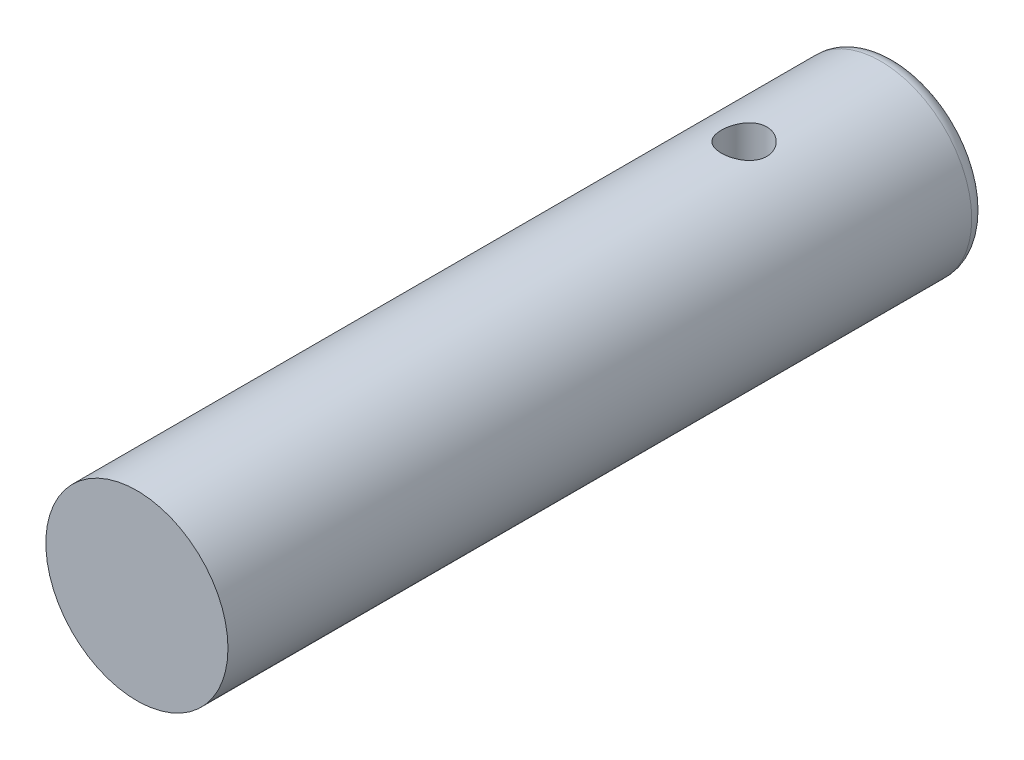
ISO-10303-21;
HEADER;
FILE_DESCRIPTION(('STEP AP214'),'2;1');
FILE_NAME('part.step','',(''),(''),'','','');
FILE_SCHEMA(('AUTOMOTIVE_DESIGN { 1 0 10303 214 1 1 1 1 }'));
ENDSEC;
DATA;
#1=APPLICATION_CONTEXT('core data for automotive mechanical design processes');
#2=APPLICATION_PROTOCOL_DEFINITION('international standard','automotive_design',2000,#1);
#3=PRODUCT_CONTEXT('',#1,'mechanical');
#4=PRODUCT('Part','Part','',(#3));
#5=PRODUCT_RELATED_PRODUCT_CATEGORY('part','',(#4));
#6=PRODUCT_DEFINITION_FORMATION('','',#4);
#7=PRODUCT_DEFINITION_CONTEXT('part definition',#1,'design');
#8=PRODUCT_DEFINITION('design','',#6,#7);
#9=PRODUCT_DEFINITION_SHAPE('','',#8);
#10=(LENGTH_UNIT() NAMED_UNIT(*) SI_UNIT(.MILLI.,.METRE.));
#11=(NAMED_UNIT(*) PLANE_ANGLE_UNIT() SI_UNIT($,.RADIAN.));
#12=(NAMED_UNIT(*) SI_UNIT($,.STERADIAN.) SOLID_ANGLE_UNIT());
#13=UNCERTAINTY_MEASURE_WITH_UNIT(LENGTH_MEASURE(1.E-05),#10,'distance_accuracy_value','');
#14=(GEOMETRIC_REPRESENTATION_CONTEXT(3) GLOBAL_UNCERTAINTY_ASSIGNED_CONTEXT((#13)) GLOBAL_UNIT_ASSIGNED_CONTEXT((#10,
#11,#12)) REPRESENTATION_CONTEXT('',''));
#15=CARTESIAN_POINT('',(0.,0.,0.));
#16=DIRECTION('',(0.,0.,1.));
#17=DIRECTION('',(1.,0.,0.));
#18=AXIS2_PLACEMENT_3D('',#15,#16,#17);
#19=CARTESIAN_POINT('',(0.,0.,25.));
#20=DIRECTION('',(0.,0.,-1.));
#21=DIRECTION('',(-1.,0.,0.));
#22=AXIS2_PLACEMENT_3D('',#19,#20,#21);
#23=CYLINDRICAL_SURFACE('',#22,3.);
#24=CARTESIAN_POINT('',(0.,0.,0.5));
#25=DIRECTION('',(0.,0.,1.));
#26=DIRECTION('',(1.,0.,0.));
#27=AXIS2_PLACEMENT_3D('',#24,#25,#26);
#28=CIRCLE('',#27,3.);
#29=CARTESIAN_POINT('',(3.,0.,0.5));
#30=VERTEX_POINT('',#29);
#31=EDGE_CURVE('E43',#30,#30,#28,.T.);
#32=ORIENTED_EDGE('',*,*,#31,.T.);
#33=EDGE_LOOP('',(#32));
#34=FACE_BOUND('',#33,.T.);
#35=CARTESIAN_POINT('',(0.,-3.,5.75));
#36=CARTESIAN_POINT('',(0.0414380443348666,-2.99999929934006,5.74999883713092));
#37=CARTESIAN_POINT('',(0.0828890789153827,-2.99913289065914,5.74655422461311));
#38=CARTESIAN_POINT('',(0.164603161885267,-2.99576056914946,5.7328874243465));
#39=CARTESIAN_POINT('',(0.204865523435371,-2.99325372709984,5.72266139523108));
#40=CARTESIAN_POINT('',(0.283010436091289,-2.9868781316602,5.69578037326896));
#41=CARTESIAN_POINT('',(0.320895781715002,-2.98301101421043,5.67913310064236));
#42=CARTESIAN_POINT('',(0.393336065952214,-2.97432671903796,5.63990930497758));
#43=CARTESIAN_POINT('',(0.427890892174381,-2.96950950927025,5.61733258194053));
#44=CARTESIAN_POINT('',(0.493400963650461,-2.95933706795901,5.56639960517289));
#45=CARTESIAN_POINT('',(0.524277845030537,-2.95397353574266,5.53794421252041));
#46=CARTESIAN_POINT('',(0.580874463601654,-2.94336810058765,5.47627389754554));
#47=CARTESIAN_POINT('',(0.606593618474568,-2.93812621144174,5.44305843852675));
#48=CARTESIAN_POINT('',(0.652513271399517,-2.92827387849855,5.37220238663128));
#49=CARTESIAN_POINT('',(0.67262610796268,-2.92367397235302,5.3345033845948));
#50=CARTESIAN_POINT('',(0.706198454275265,-2.91574747406112,5.25612579417082));
#51=CARTESIAN_POINT('',(0.719659027719668,-2.91242067836394,5.21544768333712));
#52=CARTESIAN_POINT('',(0.739277418402146,-2.90750238358775,5.13312825089876));
#53=CARTESIAN_POINT('',(0.74557613416667,-2.90587745537713,5.0915225519751));
#54=CARTESIAN_POINT('',(0.751130887533927,-2.9044468126887,5.00781571549301));
#55=CARTESIAN_POINT('',(0.75038807090899,-2.90464080224322,4.9657146596507));
#56=CARTESIAN_POINT('',(0.741993262319641,-2.90679602748309,4.88329209612776));
#57=CARTESIAN_POINT('',(0.734509170095261,-2.9087143150094,4.84295218926745));
#58=CARTESIAN_POINT('',(0.713112093451554,-2.91403354838242,4.76411947454435));
#59=CARTESIAN_POINT('',(0.699198651034713,-2.91743459985348,4.72562679848551));
#60=CARTESIAN_POINT('',(0.665194738968578,-2.92537556952093,4.65113099187397));
#61=CARTESIAN_POINT('',(0.645043333616456,-2.92992663734711,4.61515691410522));
#62=CARTESIAN_POINT('',(0.599178138007478,-2.93964855423193,4.54704064512158));
#63=CARTESIAN_POINT('',(0.57346337440442,-2.94481951167368,4.51489912596637));
#64=CARTESIAN_POINT('',(0.51633171234061,-2.95537940269891,4.4543981921528));
#65=CARTESIAN_POINT('',(0.484773129082931,-2.96077034738986,4.42617275496933));
#66=CARTESIAN_POINT('',(0.417305958751851,-2.97102982789393,4.37538937876805));
#67=CARTESIAN_POINT('',(0.381397238853972,-2.97589834774708,4.35283161286822));
#68=CARTESIAN_POINT('',(0.306057944340697,-2.98458866047091,4.31397470688781));
#69=CARTESIAN_POINT('',(0.266615696604312,-2.98840680063863,4.29769732987279));
#70=CARTESIAN_POINT('',(0.185438004071442,-2.99453958495709,4.27204134714521));
#71=CARTESIAN_POINT('',(0.143702999575243,-2.99685451669641,4.26266142179093));
#72=CARTESIAN_POINT('',(0.0602699851950145,-2.99967749635687,4.25127121722058));
#73=CARTESIAN_POINT('',(0.018598359994106,-3.00023026754139,4.24907848696235));
#74=CARTESIAN_POINT('',(-0.0645164374007528,-2.99959402407225,4.25162450102774));
#75=CARTESIAN_POINT('',(-0.105959629822296,-2.99840516620923,4.25636262139957));
#76=CARTESIAN_POINT('',(-0.186807134388245,-2.99444790563679,4.27248545419569));
#77=CARTESIAN_POINT('',(-0.226232559484376,-2.99170317092906,4.28377063173849));
#78=CARTESIAN_POINT('',(-0.302628646226255,-2.98494353317067,4.31255354201422));
#79=CARTESIAN_POINT('',(-0.339599059516316,-2.98092850184946,4.33005190215659));
#80=CARTESIAN_POINT('',(-0.410761567214923,-2.97196653963155,4.37111806443736));
#81=CARTESIAN_POINT('',(-0.444892720917914,-2.96700433683466,4.39478805619838));
#82=CARTESIAN_POINT('',(-0.508763306821622,-2.9567225459371,4.44739495439849));
#83=CARTESIAN_POINT('',(-0.538501979486503,-2.95140289625852,4.47633276980845));
#84=CARTESIAN_POINT('',(-0.593495284036364,-2.94084478480386,4.53950098042223));
#85=CARTESIAN_POINT('',(-0.618621933811015,-2.93561152093641,4.57384385150121));
#86=CARTESIAN_POINT('',(-0.662755379506347,-2.92596439188619,4.64636631723286));
#87=CARTESIAN_POINT('',(-0.681762447078967,-2.92155049033513,4.68454574147988));
#88=CARTESIAN_POINT('',(-0.712975710304645,-2.91409047367333,4.76345286120654));
#89=CARTESIAN_POINT('',(-0.725222198327031,-2.91103627645953,4.80416381417201));
#90=CARTESIAN_POINT('',(-0.742672829976888,-2.90663372045092,4.88715481894455));
#91=CARTESIAN_POINT('',(-0.747878513739328,-2.90528498859968,4.92943452551625));
#92=CARTESIAN_POINT('',(-0.751019295166996,-2.90447450601978,5.0130605119276));
#93=CARTESIAN_POINT('',(-0.749158948890058,-2.90495966364132,5.05439871756237));
#94=CARTESIAN_POINT('',(-0.738688639156432,-2.90763954503921,5.13615194433399));
#95=CARTESIAN_POINT('',(-0.730078811343383,-2.90983423445928,5.17656698400683));
#96=CARTESIAN_POINT('',(-0.706465659721396,-2.91565630341361,5.2551042295327));
#97=CARTESIAN_POINT('',(-0.691500702340187,-2.91927507618155,5.2932386526201));
#98=CARTESIAN_POINT('',(-0.655632456802534,-2.92753877862414,5.36648269135685));
#99=CARTESIAN_POINT('',(-0.634728345017094,-2.93218385060387,5.40159188659346));
#100=CARTESIAN_POINT('',(-0.586933874318567,-2.94212817131756,5.46877731450101));
#101=CARTESIAN_POINT('',(-0.559901581456126,-2.94744132415879,5.50075053671198));
#102=CARTESIAN_POINT('',(-0.500894685594866,-2.95804013623143,5.5597735223977));
#103=CARTESIAN_POINT('',(-0.468918910630571,-2.9633257886353,5.58682211505649));
#104=CARTESIAN_POINT('',(-0.400233793351294,-2.97338827823832,5.6357056542823));
#105=CARTESIAN_POINT('',(-0.363449211158192,-2.97815416682934,5.65743730683579));
#106=CARTESIAN_POINT('',(-0.286633029755237,-2.98652462487559,5.69437373147027));
#107=CARTESIAN_POINT('',(-0.246603781718368,-2.99013002599891,5.70958318032427));
#108=CARTESIAN_POINT('',(-0.172205126621735,-2.99524029782771,5.73078591516483));
#109=CARTESIAN_POINT('',(-0.138190085454033,-2.99701292526345,5.73797562152672));
#110=CARTESIAN_POINT('',(-0.0694530357681405,-2.99939302615974,5.74758297181097));
#111=CARTESIAN_POINT('',(-0.034731080621307,-3.00000058725447,5.75000097465265));
#112=CARTESIAN_POINT('',(0.,-3.,5.75));
#113=B_SPLINE_CURVE_WITH_KNOTS('',3,(#35,#36,#37,#38,#39,#40,#41,#42,#43,#44,#45,#46,#47,#48,
#49,#50,#51,#52,#53,#54,#55,#56,#57,#58,#59,#60,#61,#62,#63,#64,#65,#66,#67,#68,#69,#70,#71,#72,
#73,#74,#75,#76,#77,#78,#79,#80,#81,#82,#83,#84,#85,#86,#87,#88,#89,#90,#91,#92,#93,#94,#95,#96,
#97,#98,#99,#100,#101,#102,#103,#104,#105,#106,#107,#108,#109,#110,#111,#112),.UNSPECIFIED.,.T.,
.F.,(4,2,2,2,2,2,2,2,2,2,2,2,2,2,2,2,2,2,2,2,2,2,2,2,2,2,2,2,2,2,2,2,2,2,2,2,2,2,4),(0.,
0.124186856235945,0.24844411888195,0.372552451143053,0.496664970084664,0.623072177185696,
0.74949364790031,0.877793237729034,1.00607230584684,1.13178147549715,1.25747019056348,
1.38011248503509,1.50276351733019,1.6266526393694,1.75056345418081,1.8780075048451,
2.00545544779124,2.13334114504557,2.26120236844321,2.38579154474638,2.51036950556371,
2.63310137257019,2.75584563661145,2.88076793782676,3.00571181504009,3.13372254602238,
3.26172759374754,3.38896127307018,3.51616711626204,3.63971890199306,3.76326820478017,
3.88608200279723,4.0089128406845,4.13494788204955,4.26101284885209,4.38936092749794,
4.51761681910675,4.62171121471074,4.7257977802152),.UNSPECIFIED.);
#114=CARTESIAN_POINT('',(0.,-3.,5.75));
#115=VERTEX_POINT('',#114);
#116=EDGE_CURVE('E47',#115,#115,#113,.T.);
#117=ORIENTED_EDGE('',*,*,#116,.T.);
#118=EDGE_LOOP('',(#117));
#119=FACE_BOUND('',#118,.T.);
#120=CARTESIAN_POINT('',(0.,3.,5.75));
#121=CARTESIAN_POINT('',(-0.0414380443348656,2.99999929934006,5.74999883713092));
#122=CARTESIAN_POINT('',(-0.0828890789153817,2.99913289065914,5.74655422461311));
#123=CARTESIAN_POINT('',(-0.164603161885267,2.99576056914946,5.7328874243465));
#124=CARTESIAN_POINT('',(-0.20486552343537,2.99325372709984,5.72266139523108));
#125=CARTESIAN_POINT('',(-0.283010436091289,2.9868781316602,5.69578037326896));
#126=CARTESIAN_POINT('',(-0.320895781715002,2.98301101421043,5.67913310064236));
#127=CARTESIAN_POINT('',(-0.393336065952213,2.97432671903797,5.63990930497758));
#128=CARTESIAN_POINT('',(-0.42789089217438,2.96950950927025,5.61733258194053));
#129=CARTESIAN_POINT('',(-0.49340096365046,2.95933706795901,5.56639960517289));
#130=CARTESIAN_POINT('',(-0.524277845030536,2.95397353574267,5.53794421252041));
#131=CARTESIAN_POINT('',(-0.580874463601652,2.94336810058765,5.47627389754554));
#132=CARTESIAN_POINT('',(-0.606593618474567,2.93812621144174,5.44305843852675));
#133=CARTESIAN_POINT('',(-0.652513271399516,2.92827387849855,5.37220238663128));
#134=CARTESIAN_POINT('',(-0.672626107962678,2.92367397235303,5.3345033845948));
#135=CARTESIAN_POINT('',(-0.706198454275263,2.91574747406112,5.25612579417082));
#136=CARTESIAN_POINT('',(-0.719659027719666,2.91242067836394,5.21544768333712));
#137=CARTESIAN_POINT('',(-0.739277418402144,2.90750238358775,5.13312825089876));
#138=CARTESIAN_POINT('',(-0.745576134166668,2.90587745537713,5.0915225519751));
#139=CARTESIAN_POINT('',(-0.751130887533925,2.9044468126887,5.00781571549301));
#140=CARTESIAN_POINT('',(-0.750388070908988,2.90464080224322,4.96571465965069));
#141=CARTESIAN_POINT('',(-0.741993262319639,2.90679602748309,4.88329209612776));
#142=CARTESIAN_POINT('',(-0.734509170095259,2.9087143150094,4.84295218926745));
#143=CARTESIAN_POINT('',(-0.713112093451552,2.91403354838242,4.76411947454435));
#144=CARTESIAN_POINT('',(-0.69919865103471,2.91743459985348,4.72562679848551));
#145=CARTESIAN_POINT('',(-0.665194738968575,2.92537556952093,4.65113099187397));
#146=CARTESIAN_POINT('',(-0.645043333616454,2.92992663734711,4.61515691410522));
#147=CARTESIAN_POINT('',(-0.599178138007475,2.93964855423193,4.54704064512158));
#148=CARTESIAN_POINT('',(-0.573463374404418,2.94481951167368,4.51489912596637));
#149=CARTESIAN_POINT('',(-0.516331712340607,2.95537940269891,4.4543981921528));
#150=CARTESIAN_POINT('',(-0.484773129082928,2.96077034738986,4.42617275496933));
#151=CARTESIAN_POINT('',(-0.417305958751848,2.97102982789393,4.37538937876805));
#152=CARTESIAN_POINT('',(-0.38139723885397,2.97589834774708,4.35283161286822));
#153=CARTESIAN_POINT('',(-0.306057944340694,2.98458866047091,4.31397470688781));
#154=CARTESIAN_POINT('',(-0.26661569660431,2.98840680063863,4.29769732987279));
#155=CARTESIAN_POINT('',(-0.185438004071439,2.99453958495709,4.27204134714521));
#156=CARTESIAN_POINT('',(-0.14370299957524,2.99685451669641,4.26266142179093));
#157=CARTESIAN_POINT('',(-0.0602699851950114,2.99967749635687,4.25127121722058));
#158=CARTESIAN_POINT('',(-0.0185983599941029,3.00023026754139,4.24907848696235));
#159=CARTESIAN_POINT('',(0.064516437400756,2.99959402407225,4.25162450102774));
#160=CARTESIAN_POINT('',(0.105959629822299,2.99840516620923,4.25636262139957));
#161=CARTESIAN_POINT('',(0.186807134388248,2.99444790563679,4.27248545419569));
#162=CARTESIAN_POINT('',(0.226232559484379,2.99170317092906,4.28377063173849));
#163=CARTESIAN_POINT('',(0.302628646226258,2.98494353317067,4.31255354201422));
#164=CARTESIAN_POINT('',(0.339599059516319,2.98092850184946,4.33005190215659));
#165=CARTESIAN_POINT('',(0.410761567214926,2.97196653963155,4.37111806443737));
#166=CARTESIAN_POINT('',(0.444892720917917,2.96700433683466,4.39478805619838));
#167=CARTESIAN_POINT('',(0.508763306821625,2.9567225459371,4.44739495439849));
#168=CARTESIAN_POINT('',(0.538501979486506,2.95140289625852,4.47633276980846));
#169=CARTESIAN_POINT('',(0.593495284036367,2.94084478480386,4.53950098042223));
#170=CARTESIAN_POINT('',(0.618621933811017,2.93561152093641,4.57384385150121));
#171=CARTESIAN_POINT('',(0.66275537950635,2.92596439188619,4.64636631723286));
#172=CARTESIAN_POINT('',(0.68176244707897,2.92155049033513,4.68454574147988));
#173=CARTESIAN_POINT('',(0.712975710304647,2.91409047367333,4.76345286120654));
#174=CARTESIAN_POINT('',(0.725222198327034,2.91103627645953,4.80416381417201));
#175=CARTESIAN_POINT('',(0.742672829976891,2.90663372045092,4.88715481894456));
#176=CARTESIAN_POINT('',(0.74787851373933,2.90528498859968,4.92943452551625));
#177=CARTESIAN_POINT('',(0.751019295166998,2.90447450601978,5.0130605119276));
#178=CARTESIAN_POINT('',(0.74915894889006,2.90495966364132,5.05439871756237));
#179=CARTESIAN_POINT('',(0.738688639156435,2.90763954503921,5.13615194433399));
#180=CARTESIAN_POINT('',(0.730078811343385,2.90983423445928,5.17656698400683));
#181=CARTESIAN_POINT('',(0.706465659721398,2.91565630341361,5.25510422953271));
#182=CARTESIAN_POINT('',(0.691500702340189,2.91927507618155,5.29323865262011));
#183=CARTESIAN_POINT('',(0.655632456802536,2.92753877862414,5.36648269135685));
#184=CARTESIAN_POINT('',(0.634728345017095,2.93218385060387,5.40159188659346));
#185=CARTESIAN_POINT('',(0.586933874318569,2.94212817131756,5.46877731450101));
#186=CARTESIAN_POINT('',(0.559901581456128,2.94744132415879,5.50075053671198));
#187=CARTESIAN_POINT('',(0.500894685594868,2.95804013623143,5.55977352239771));
#188=CARTESIAN_POINT('',(0.468918910630573,2.9633257886353,5.58682211505649));
#189=CARTESIAN_POINT('',(0.400233793351295,2.97338827823831,5.63570565428231));
#190=CARTESIAN_POINT('',(0.363449211158193,2.97815416682934,5.65743730683579));
#191=CARTESIAN_POINT('',(0.286633029755238,2.98652462487559,5.69437373147027));
#192=CARTESIAN_POINT('',(0.24660378171837,2.99013002599891,5.70958318032427));
#193=CARTESIAN_POINT('',(0.172205126621736,2.99524029782771,5.73078591516483));
#194=CARTESIAN_POINT('',(0.138190085454034,2.99701292526345,5.73797562152672));
#195=CARTESIAN_POINT('',(0.0694530357681417,2.99939302615974,5.74758297181097));
#196=CARTESIAN_POINT('',(0.0347310806213081,3.00000058725447,5.75000097465265));
#197=CARTESIAN_POINT('',(0.,3.,5.75));
#198=B_SPLINE_CURVE_WITH_KNOTS('',3,(#120,#121,#122,#123,#124,#125,#126,#127,#128,#129,#130,
#131,#132,#133,#134,#135,#136,#137,#138,#139,#140,#141,#142,#143,#144,#145,#146,#147,#148,#149,
#150,#151,#152,#153,#154,#155,#156,#157,#158,#159,#160,#161,#162,#163,#164,#165,#166,#167,#168,
#169,#170,#171,#172,#173,#174,#175,#176,#177,#178,#179,#180,#181,#182,#183,#184,#185,#186,#187,
#188,#189,#190,#191,#192,#193,#194,#195,#196,#197),.UNSPECIFIED.,.T.,.F.,(4,2,2,2,2,2,2,2,2,2,2,
2,2,2,2,2,2,2,2,2,2,2,2,2,2,2,2,2,2,2,2,2,2,2,2,2,2,2,4),(0.,0.124186856235945,0.24844411888195,
0.372552451143054,0.496664970084664,0.623072177185695,0.74949364790031,0.877793237729035,
1.00607230584684,1.13178147549715,1.25747019056349,1.38011248503509,1.50276351733019,
1.6266526393694,1.75056345418081,1.8780075048451,2.00545544779124,2.13334114504557,
2.26120236844321,2.38579154474638,2.51036950556371,2.63310137257019,2.75584563661145,
2.88076793782676,3.0057118150401,3.13372254602238,3.26172759374754,3.38896127307018,
3.51616711626204,3.63971890199306,3.76326820478017,3.88608200279724,4.00891284068451,
4.13494788204955,4.26101284885209,4.38936092749794,4.51761681910675,4.62171121471075,
4.7257977802152),.UNSPECIFIED.);
#199=CARTESIAN_POINT('',(0.,3.,5.75));
#200=VERTEX_POINT('',#199);
#201=EDGE_CURVE('E51',#200,#200,#198,.T.);
#202=ORIENTED_EDGE('',*,*,#201,.T.);
#203=EDGE_LOOP('',(#202));
#204=FACE_BOUND('',#203,.T.);
#205=CARTESIAN_POINT('',(0.,0.,25.));
#206=DIRECTION('',(0.,0.,1.));
#207=DIRECTION('',(1.,0.,0.));
#208=AXIS2_PLACEMENT_3D('',#205,#206,#207);
#209=CIRCLE('',#208,3.);
#210=CARTESIAN_POINT('',(3.,0.,25.));
#211=VERTEX_POINT('',#210);
#212=EDGE_CURVE('E88',#211,#211,#209,.T.);
#213=ORIENTED_EDGE('',*,*,#212,.F.);
#214=EDGE_LOOP('',(#213));
#215=FACE_BOUND('',#214,.T.);
#216=ADVANCED_FACE('F36',(#34,#119,#204,#215),#23,.T.);
#217=CARTESIAN_POINT('',(0.,0.,25.));
#218=DIRECTION('',(0.,0.,1.));
#219=DIRECTION('',(1.,0.,0.));
#220=AXIS2_PLACEMENT_3D('',#217,#218,#219);
#221=PLANE('',#220);
#222=ORIENTED_EDGE('',*,*,#212,.T.);
#223=EDGE_LOOP('',(#222));
#224=FACE_BOUND('',#223,.T.);
#225=ADVANCED_FACE('F70',(#224),#221,.T.);
#226=CARTESIAN_POINT('',(0.,0.,0.));
#227=DIRECTION('',(0.,0.,1.));
#228=DIRECTION('',(1.,0.,0.));
#229=AXIS2_PLACEMENT_3D('',#226,#227,#228);
#230=PLANE('',#229);
#231=CARTESIAN_POINT('',(0.,0.,0.));
#232=DIRECTION('',(0.,0.,1.));
#233=DIRECTION('',(1.,0.,0.));
#234=AXIS2_PLACEMENT_3D('',#231,#232,#233);
#235=CIRCLE('',#234,2.5);
#236=CARTESIAN_POINT('',(2.5,0.,0.));
#237=VERTEX_POINT('',#236);
#238=EDGE_CURVE('E10',#237,#237,#235,.F.);
#239=ORIENTED_EDGE('',*,*,#238,.T.);
#240=EDGE_LOOP('',(#239));
#241=FACE_BOUND('',#240,.T.);
#242=ADVANCED_FACE('F68',(#241),#230,.F.);
#243=CARTESIAN_POINT('',(0.,-3.,5.));
#244=DIRECTION('',(0.,1.,0.));
#245=DIRECTION('',(0.,0.,1.));
#246=AXIS2_PLACEMENT_3D('',#243,#244,#245);
#247=CYLINDRICAL_SURFACE('',#246,0.75);
#248=ORIENTED_EDGE('',*,*,#201,.F.);
#249=EDGE_LOOP('',(#248));
#250=FACE_BOUND('',#249,.T.);
#251=ORIENTED_EDGE('',*,*,#116,.F.);
#252=EDGE_LOOP('',(#251));
#253=FACE_BOUND('',#252,.T.);
#254=ADVANCED_FACE('F64',(#250,#253),#247,.F.);
#255=CARTESIAN_POINT('',(0.,0.,0.5));
#256=DIRECTION('',(0.,0.,1.));
#257=DIRECTION('',(1.,0.,0.));
#258=AXIS2_PLACEMENT_3D('',#255,#256,#257);
#259=TOROIDAL_SURFACE('',#258,2.5,0.5);
#260=ORIENTED_EDGE('',*,*,#238,.F.);
#261=EDGE_LOOP('',(#260));
#262=FACE_BOUND('',#261,.T.);
#263=ORIENTED_EDGE('',*,*,#31,.F.);
#264=EDGE_LOOP('',(#263));
#265=FACE_BOUND('',#264,.T.);
#266=ADVANCED_FACE('F38',(#262,#265),#259,.T.);
#267=CLOSED_SHELL('',(#216,#225,#242,#254,#266));
#268=MANIFOLD_SOLID_BREP('B2',#267);
#269=ADVANCED_BREP_SHAPE_REPRESENTATION('',(#18,#268),#14);
#270=SHAPE_DEFINITION_REPRESENTATION(#9,#269);
ENDSEC;
END-ISO-10303-21;
